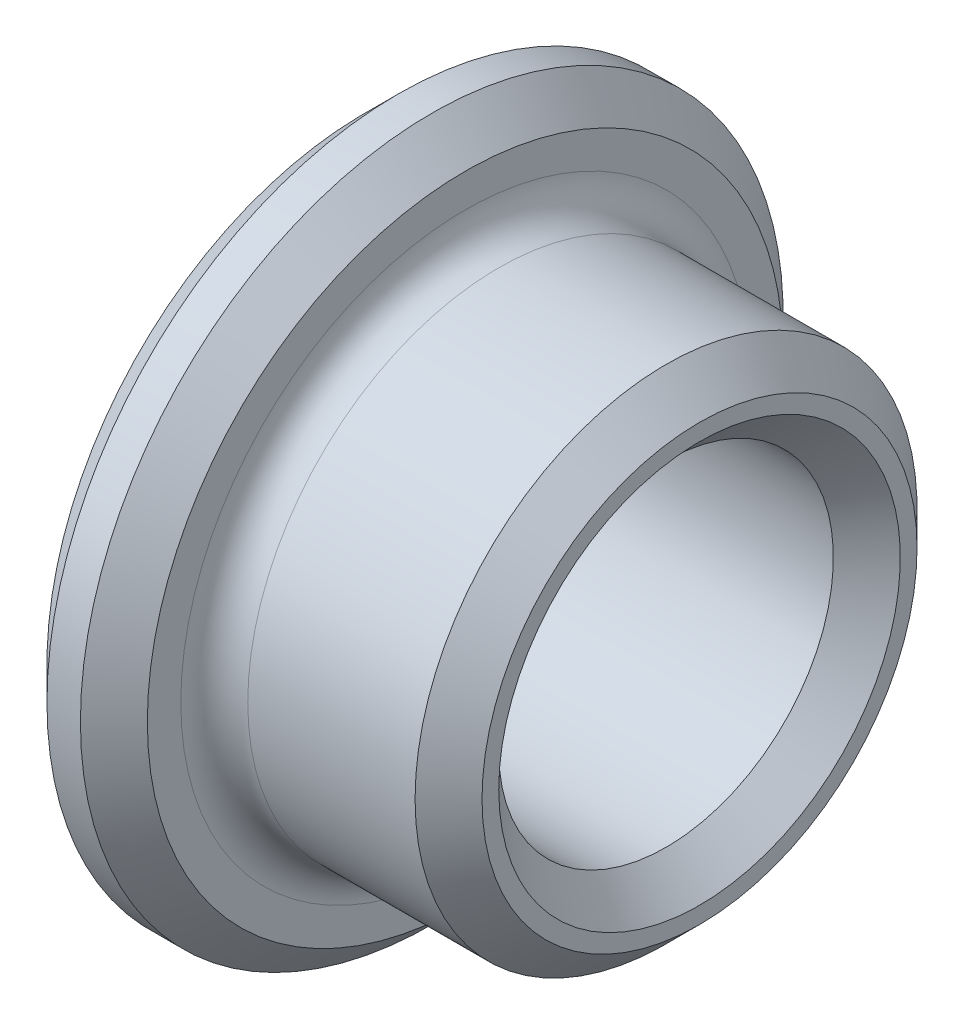
ISO-10303-21;
HEADER;
FILE_DESCRIPTION(('STEP AP214'),'2;1');
FILE_NAME('part.step','',(''),(''),'','','');
FILE_SCHEMA(('AUTOMOTIVE_DESIGN { 1 0 10303 214 1 1 1 1 }'));
ENDSEC;
DATA;
#1=APPLICATION_CONTEXT('core data for automotive mechanical design processes');
#2=APPLICATION_PROTOCOL_DEFINITION('international standard','automotive_design',2000,#1);
#3=PRODUCT_CONTEXT('',#1,'mechanical');
#4=PRODUCT('Part','Part','',(#3));
#5=PRODUCT_RELATED_PRODUCT_CATEGORY('part','',(#4));
#6=PRODUCT_DEFINITION_FORMATION('','',#4);
#7=PRODUCT_DEFINITION_CONTEXT('part definition',#1,'design');
#8=PRODUCT_DEFINITION('design','',#6,#7);
#9=PRODUCT_DEFINITION_SHAPE('','',#8);
#10=(LENGTH_UNIT() NAMED_UNIT(*) SI_UNIT(.MILLI.,.METRE.));
#11=(NAMED_UNIT(*) PLANE_ANGLE_UNIT() SI_UNIT($,.RADIAN.));
#12=(NAMED_UNIT(*) SI_UNIT($,.STERADIAN.) SOLID_ANGLE_UNIT());
#13=UNCERTAINTY_MEASURE_WITH_UNIT(LENGTH_MEASURE(1.E-05),#10,'distance_accuracy_value','');
#14=(GEOMETRIC_REPRESENTATION_CONTEXT(3) GLOBAL_UNCERTAINTY_ASSIGNED_CONTEXT((#13)) GLOBAL_UNIT_ASSIGNED_CONTEXT((#10,
#11,#12)) REPRESENTATION_CONTEXT('',''));
#15=CARTESIAN_POINT('',(0.,0.,0.));
#16=DIRECTION('',(0.,0.,1.));
#17=DIRECTION('',(1.,0.,0.));
#18=AXIS2_PLACEMENT_3D('',#15,#16,#17);
#19=CARTESIAN_POINT('',(0.,10.5,0.));
#20=DIRECTION('',(1.,0.,0.));
#21=DIRECTION('',(0.,0.,-1.));
#22=AXIS2_PLACEMENT_3D('',#19,#20,#21);
#23=PLANE('',#22);
#24=CARTESIAN_POINT('',(0.,0.,0.));
#25=DIRECTION('',(1.,0.,0.));
#26=DIRECTION('',(0.,0.,-1.));
#27=AXIS2_PLACEMENT_3D('',#24,#25,#26);
#28=CIRCLE('',#27,6.);
#29=CARTESIAN_POINT('',(0.,0.,-6.));
#30=VERTEX_POINT('',#29);
#31=EDGE_CURVE('E67',#30,#30,#28,.T.);
#32=ORIENTED_EDGE('',*,*,#31,.T.);
#33=EDGE_LOOP('',(#32));
#34=FACE_BOUND('',#33,.T.);
#35=CARTESIAN_POINT('',(0.,0.,0.));
#36=DIRECTION('',(1.,0.,0.));
#37=DIRECTION('',(0.,0.,-1.));
#38=AXIS2_PLACEMENT_3D('',#35,#36,#37);
#39=CIRCLE('',#38,9.49999999999999);
#40=CARTESIAN_POINT('',(0.,0.,-9.49999999999999));
#41=VERTEX_POINT('',#40);
#42=EDGE_CURVE('E70',#41,#41,#39,.F.);
#43=ORIENTED_EDGE('',*,*,#42,.T.);
#44=EDGE_LOOP('',(#43));
#45=FACE_BOUND('',#44,.T.);
#46=ADVANCED_FACE('F35',(#34,#45),#23,.F.);
#47=CARTESIAN_POINT('',(0.,0.,0.));
#48=DIRECTION('',(-1.,0.,0.));
#49=DIRECTION('',(0.,0.,1.));
#50=AXIS2_PLACEMENT_3D('',#47,#48,#49);
#51=CYLINDRICAL_SURFACE('',#50,5.);
#52=CARTESIAN_POINT('',(1.,0.,0.));
#53=DIRECTION('',(1.,0.,0.));
#54=DIRECTION('',(0.,0.,-1.));
#55=AXIS2_PLACEMENT_3D('',#52,#53,#54);
#56=CIRCLE('',#55,5.);
#57=CARTESIAN_POINT('',(1.,0.,-5.));
#58=VERTEX_POINT('',#57);
#59=EDGE_CURVE('E73',#58,#58,#56,.F.);
#60=ORIENTED_EDGE('',*,*,#59,.T.);
#61=EDGE_LOOP('',(#60));
#62=FACE_BOUND('',#61,.T.);
#63=CARTESIAN_POINT('',(8.99999999999999,0.,0.));
#64=DIRECTION('',(-1.,0.,0.));
#65=DIRECTION('',(0.,0.,1.));
#66=AXIS2_PLACEMENT_3D('',#63,#64,#65);
#67=CIRCLE('',#66,5.);
#68=CARTESIAN_POINT('',(8.99999999999999,0.,5.));
#69=VERTEX_POINT('',#68);
#70=EDGE_CURVE('E76',#69,#69,#67,.F.);
#71=ORIENTED_EDGE('',*,*,#70,.T.);
#72=EDGE_LOOP('',(#71));
#73=FACE_BOUND('',#72,.T.);
#74=ADVANCED_FACE('F80',(#62,#73),#51,.F.);
#75=CARTESIAN_POINT('',(10.,5.,0.));
#76=DIRECTION('',(-1.,0.,0.));
#77=DIRECTION('',(0.,0.,1.));
#78=AXIS2_PLACEMENT_3D('',#75,#76,#77);
#79=PLANE('',#78);
#80=CARTESIAN_POINT('',(10.,0.,0.));
#81=DIRECTION('',(-1.,0.,0.));
#82=DIRECTION('',(0.,0.,1.));
#83=AXIS2_PLACEMENT_3D('',#80,#81,#82);
#84=CIRCLE('',#83,6.00000000000001);
#85=CARTESIAN_POINT('',(10.,0.,6.00000000000001));
#86=VERTEX_POINT('',#85);
#87=EDGE_CURVE('E61',#86,#86,#84,.T.);
#88=ORIENTED_EDGE('',*,*,#87,.T.);
#89=EDGE_LOOP('',(#88));
#90=FACE_BOUND('',#89,.T.);
#91=CARTESIAN_POINT('',(10.,0.,0.));
#92=DIRECTION('',(-1.,0.,0.));
#93=DIRECTION('',(0.,0.,1.));
#94=AXIS2_PLACEMENT_3D('',#91,#92,#93);
#95=CIRCLE('',#94,6.5);
#96=CARTESIAN_POINT('',(10.,0.,6.5));
#97=VERTEX_POINT('',#96);
#98=EDGE_CURVE('E64',#97,#97,#95,.F.);
#99=ORIENTED_EDGE('',*,*,#98,.T.);
#100=EDGE_LOOP('',(#99));
#101=FACE_BOUND('',#100,.T.);
#102=ADVANCED_FACE('F90',(#90,#101),#79,.F.);
#103=CARTESIAN_POINT('',(0.,0.,0.));
#104=DIRECTION('',(-1.,0.,0.));
#105=DIRECTION('',(0.,0.,1.));
#106=AXIS2_PLACEMENT_3D('',#103,#104,#105);
#107=CYLINDRICAL_SURFACE('',#106,7.5);
#108=CARTESIAN_POINT('',(4.,0.,0.));
#109=DIRECTION('',(-1.,0.,0.));
#110=DIRECTION('',(0.,0.,1.));
#111=AXIS2_PLACEMENT_3D('',#108,#109,#110);
#112=CIRCLE('',#111,7.5);
#113=CARTESIAN_POINT('',(4.,0.,7.5));
#114=VERTEX_POINT('',#113);
#115=EDGE_CURVE('E10',#114,#114,#112,.F.);
#116=ORIENTED_EDGE('',*,*,#115,.T.);
#117=EDGE_LOOP('',(#116));
#118=FACE_BOUND('',#117,.T.);
#119=CARTESIAN_POINT('',(9.,0.,0.));
#120=DIRECTION('',(-1.,0.,0.));
#121=DIRECTION('',(0.,0.,1.));
#122=AXIS2_PLACEMENT_3D('',#119,#120,#121);
#123=CIRCLE('',#122,7.5);
#124=CARTESIAN_POINT('',(9.,0.,7.5));
#125=VERTEX_POINT('',#124);
#126=EDGE_CURVE('E46',#125,#125,#123,.T.);
#127=ORIENTED_EDGE('',*,*,#126,.T.);
#128=EDGE_LOOP('',(#127));
#129=FACE_BOUND('',#128,.T.);
#130=ADVANCED_FACE('F93',(#118,#129),#107,.T.);
#131=CARTESIAN_POINT('',(3.,7.5,0.));
#132=DIRECTION('',(-1.,0.,0.));
#133=DIRECTION('',(0.,0.,1.));
#134=AXIS2_PLACEMENT_3D('',#131,#132,#133);
#135=PLANE('',#134);
#136=CARTESIAN_POINT('',(3.,0.,0.));
#137=DIRECTION('',(-1.,0.,0.));
#138=DIRECTION('',(0.,0.,1.));
#139=AXIS2_PLACEMENT_3D('',#136,#137,#138);
#140=CIRCLE('',#139,8.5);
#141=CARTESIAN_POINT('',(3.,0.,8.5));
#142=VERTEX_POINT('',#141);
#143=EDGE_CURVE('E42',#142,#142,#140,.T.);
#144=ORIENTED_EDGE('',*,*,#143,.T.);
#145=EDGE_LOOP('',(#144));
#146=FACE_BOUND('',#145,.T.);
#147=CARTESIAN_POINT('',(3.,0.,0.));
#148=DIRECTION('',(-1.,0.,0.));
#149=DIRECTION('',(0.,0.,1.));
#150=AXIS2_PLACEMENT_3D('',#147,#148,#149);
#151=CIRCLE('',#150,9.49999999999999);
#152=CARTESIAN_POINT('',(3.,0.,9.49999999999999));
#153=VERTEX_POINT('',#152);
#154=EDGE_CURVE('E50',#153,#153,#151,.F.);
#155=ORIENTED_EDGE('',*,*,#154,.T.);
#156=EDGE_LOOP('',(#155));
#157=FACE_BOUND('',#156,.T.);
#158=ADVANCED_FACE('F104',(#146,#157),#135,.F.);
#159=CARTESIAN_POINT('',(0.,0.,0.));
#160=DIRECTION('',(-1.,0.,0.));
#161=DIRECTION('',(0.,0.,1.));
#162=AXIS2_PLACEMENT_3D('',#159,#160,#161);
#163=CYLINDRICAL_SURFACE('',#162,10.5);
#164=CARTESIAN_POINT('',(1.99999999999999,0.,0.));
#165=DIRECTION('',(-1.,0.,0.));
#166=DIRECTION('',(0.,0.,1.));
#167=AXIS2_PLACEMENT_3D('',#164,#165,#166);
#168=CIRCLE('',#167,10.5);
#169=CARTESIAN_POINT('',(1.99999999999999,0.,10.5));
#170=VERTEX_POINT('',#169);
#171=EDGE_CURVE('E55',#170,#170,#168,.T.);
#172=ORIENTED_EDGE('',*,*,#171,.T.);
#173=EDGE_LOOP('',(#172));
#174=FACE_BOUND('',#173,.T.);
#175=CARTESIAN_POINT('',(1.00000000000001,0.,0.));
#176=DIRECTION('',(1.,0.,0.));
#177=DIRECTION('',(0.,0.,-1.));
#178=AXIS2_PLACEMENT_3D('',#175,#176,#177);
#179=CIRCLE('',#178,10.5);
#180=CARTESIAN_POINT('',(1.00000000000001,0.,-10.5));
#181=VERTEX_POINT('',#180);
#182=EDGE_CURVE('E58',#181,#181,#179,.T.);
#183=ORIENTED_EDGE('',*,*,#182,.T.);
#184=EDGE_LOOP('',(#183));
#185=FACE_BOUND('',#184,.T.);
#186=ADVANCED_FACE('F109',(#174,#185),#163,.T.);
#187=CARTESIAN_POINT('',(1.,0.,0.));
#188=DIRECTION('',(-1.,0.,0.));
#189=DIRECTION('',(0.,0.,1.));
#190=AXIS2_PLACEMENT_3D('',#187,#188,#189);
#191=CONICAL_SURFACE('',#190,5.,0.785398163397448);
#192=ORIENTED_EDGE('',*,*,#31,.F.);
#193=EDGE_LOOP('',(#192));
#194=FACE_BOUND('',#193,.T.);
#195=ORIENTED_EDGE('',*,*,#59,.F.);
#196=EDGE_LOOP('',(#195));
#197=FACE_BOUND('',#196,.T.);
#198=ADVANCED_FACE('F86',(#194,#197),#191,.F.);
#199=CARTESIAN_POINT('',(10.,0.,0.));
#200=DIRECTION('',(1.,0.,0.));
#201=DIRECTION('',(0.,0.,-1.));
#202=AXIS2_PLACEMENT_3D('',#199,#200,#201);
#203=CONICAL_SURFACE('',#202,6.00000000000001,0.785398163397449);
#204=ORIENTED_EDGE('',*,*,#70,.F.);
#205=EDGE_LOOP('',(#204));
#206=FACE_BOUND('',#205,.T.);
#207=ORIENTED_EDGE('',*,*,#87,.F.);
#208=EDGE_LOOP('',(#207));
#209=FACE_BOUND('',#208,.T.);
#210=ADVANCED_FACE('F82',(#206,#209),#203,.F.);
#211=CARTESIAN_POINT('',(1.99999999999999,0.,0.));
#212=DIRECTION('',(-1.,0.,0.));
#213=DIRECTION('',(0.,0.,1.));
#214=AXIS2_PLACEMENT_3D('',#211,#212,#213);
#215=CONICAL_SURFACE('',#214,10.5,0.785398163397448);
#216=ORIENTED_EDGE('',*,*,#154,.F.);
#217=EDGE_LOOP('',(#216));
#218=FACE_BOUND('',#217,.T.);
#219=ORIENTED_EDGE('',*,*,#171,.F.);
#220=EDGE_LOOP('',(#219));
#221=FACE_BOUND('',#220,.T.);
#222=ADVANCED_FACE('F85',(#218,#221),#215,.T.);
#223=CARTESIAN_POINT('',(0.,0.,0.));
#224=DIRECTION('',(1.,0.,0.));
#225=DIRECTION('',(0.,0.,-1.));
#226=AXIS2_PLACEMENT_3D('',#223,#224,#225);
#227=CONICAL_SURFACE('',#226,9.49999999999999,0.785398163397447);
#228=ORIENTED_EDGE('',*,*,#182,.F.);
#229=EDGE_LOOP('',(#228));
#230=FACE_BOUND('',#229,.T.);
#231=ORIENTED_EDGE('',*,*,#42,.F.);
#232=EDGE_LOOP('',(#231));
#233=FACE_BOUND('',#232,.T.);
#234=ADVANCED_FACE('F100',(#230,#233),#227,.T.);
#235=CARTESIAN_POINT('',(9.,0.,0.));
#236=DIRECTION('',(-1.,0.,0.));
#237=DIRECTION('',(0.,0.,1.));
#238=AXIS2_PLACEMENT_3D('',#235,#236,#237);
#239=CONICAL_SURFACE('',#238,7.5,0.785398163397447);
#240=ORIENTED_EDGE('',*,*,#98,.F.);
#241=EDGE_LOOP('',(#240));
#242=FACE_BOUND('',#241,.T.);
#243=ORIENTED_EDGE('',*,*,#126,.F.);
#244=EDGE_LOOP('',(#243));
#245=FACE_BOUND('',#244,.T.);
#246=ADVANCED_FACE('F97',(#242,#245),#239,.T.);
#247=CARTESIAN_POINT('',(4.,0.,0.));
#248=DIRECTION('',(-1.,0.,0.));
#249=DIRECTION('',(0.,0.,1.));
#250=AXIS2_PLACEMENT_3D('',#247,#248,#249);
#251=TOROIDAL_SURFACE('',#250,8.5,1.);
#252=ORIENTED_EDGE('',*,*,#115,.F.);
#253=EDGE_LOOP('',(#252));
#254=FACE_BOUND('',#253,.T.);
#255=ORIENTED_EDGE('',*,*,#143,.F.);
#256=EDGE_LOOP('',(#255));
#257=FACE_BOUND('',#256,.T.);
#258=ADVANCED_FACE('F37',(#254,#257),#251,.F.);
#259=CLOSED_SHELL('',(#46,#74,#102,#130,#158,#186,#198,#210,#222,#234,#246,#258));
#260=MANIFOLD_SOLID_BREP('B2',#259);
#261=ADVANCED_BREP_SHAPE_REPRESENTATION('',(#18,#260),#14);
#262=SHAPE_DEFINITION_REPRESENTATION(#9,#261);
ENDSEC;
END-ISO-10303-21;
